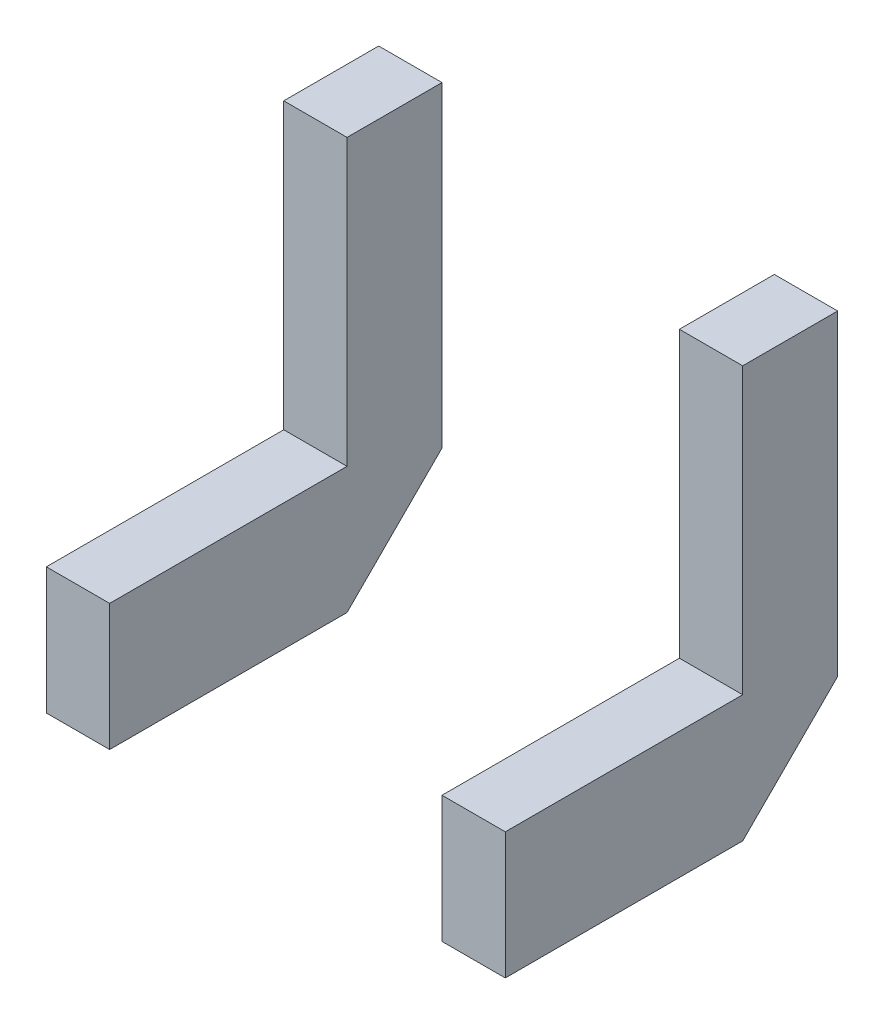
ISO-10303-21;
HEADER;
FILE_DESCRIPTION(('STEP AP214'),'2;1');
FILE_NAME('part.step','',(''),(''),'','','');
FILE_SCHEMA(('AUTOMOTIVE_DESIGN { 1 0 10303 214 1 1 1 1 }'));
ENDSEC;
DATA;
#1=APPLICATION_CONTEXT('core data for automotive mechanical design processes');
#2=APPLICATION_PROTOCOL_DEFINITION('international standard','automotive_design',2000,#1);
#3=PRODUCT_CONTEXT('',#1,'mechanical');
#4=PRODUCT('Part','Part','',(#3));
#5=PRODUCT_RELATED_PRODUCT_CATEGORY('part','',(#4));
#6=PRODUCT_DEFINITION_FORMATION('','',#4);
#7=PRODUCT_DEFINITION_CONTEXT('part definition',#1,'design');
#8=PRODUCT_DEFINITION('design','',#6,#7);
#9=PRODUCT_DEFINITION_SHAPE('','',#8);
#10=(LENGTH_UNIT() NAMED_UNIT(*) SI_UNIT(.MILLI.,.METRE.));
#11=(NAMED_UNIT(*) PLANE_ANGLE_UNIT() SI_UNIT($,.RADIAN.));
#12=(NAMED_UNIT(*) SI_UNIT($,.STERADIAN.) SOLID_ANGLE_UNIT());
#13=UNCERTAINTY_MEASURE_WITH_UNIT(LENGTH_MEASURE(1.E-05),#10,'distance_accuracy_value','');
#14=(GEOMETRIC_REPRESENTATION_CONTEXT(3) GLOBAL_UNCERTAINTY_ASSIGNED_CONTEXT((#13)) GLOBAL_UNIT_ASSIGNED_CONTEXT((#10,
#11,#12)) REPRESENTATION_CONTEXT('',''));
#15=CARTESIAN_POINT('',(0.,0.,0.));
#16=DIRECTION('',(0.,0.,1.));
#17=DIRECTION('',(1.,0.,0.));
#18=AXIS2_PLACEMENT_3D('',#15,#16,#17);
#19=CARTESIAN_POINT('',(12.22499934,-13.67500066,1.05));
#20=DIRECTION('',(-1.,0.,0.));
#21=DIRECTION('',(0.,0.,1.));
#22=AXIS2_PLACEMENT_3D('',#19,#20,#21);
#23=PLANE('',#22);
#24=DIRECTION('',(0.,-0.707106781186548,0.707106781186548));
#25=VECTOR('',#24,1.);
#26=CARTESIAN_POINT('',(12.22499934,-14.67500066,0.));
#27=LINE('',#26,#25);
#28=CARTESIAN_POINT('',(12.22499934,-14.97500066,0.3));
#29=VERTEX_POINT('',#28);
#30=CARTESIAN_POINT('',(12.22499934,-14.67500066,0.));
#31=VERTEX_POINT('',#30);
#32=EDGE_CURVE('P0_E110',#29,#31,#27,.F.);
#33=ORIENTED_EDGE('',*,*,#32,.T.);
#34=DIRECTION('',(0.,-1.,0.));
#35=VECTOR('',#34,1.);
#36=CARTESIAN_POINT('',(12.22499934,-13.67500066,0.));
#37=LINE('',#36,#35);
#38=CARTESIAN_POINT('',(12.22499934,-13.67500066,0.));
#39=VERTEX_POINT('',#38);
#40=EDGE_CURVE('P0_E88',#31,#39,#37,.F.);
#41=ORIENTED_EDGE('',*,*,#40,.T.);
#42=DIRECTION('',(0.,0.,1.));
#43=VECTOR('',#42,1.);
#44=CARTESIAN_POINT('',(12.22499934,-13.67500066,0.));
#45=LINE('',#44,#43);
#46=CARTESIAN_POINT('',(12.22499934,-13.67500066,0.3));
#47=VERTEX_POINT('',#46);
#48=EDGE_CURVE('P0_E20',#47,#39,#45,.F.);
#49=ORIENTED_EDGE('',*,*,#48,.F.);
#50=DIRECTION('',(0.,1.,0.));
#51=VECTOR('',#50,1.);
#52=CARTESIAN_POINT('',(12.22499934,-14.57500066,0.3));
#53=LINE('',#52,#51);
#54=CARTESIAN_POINT('',(12.22499934,-14.57500066,0.3));
#55=VERTEX_POINT('',#54);
#56=EDGE_CURVE('P0_E78',#47,#55,#53,.F.);
#57=ORIENTED_EDGE('',*,*,#56,.T.);
#58=DIRECTION('',(0.,0.,1.));
#59=VECTOR('',#58,1.);
#60=CARTESIAN_POINT('',(12.22499934,-14.57500066,1.05));
#61=LINE('',#60,#59);
#62=CARTESIAN_POINT('',(12.22499934,-14.57500066,1.05));
#63=VERTEX_POINT('',#62);
#64=EDGE_CURVE('P0_E73',#63,#55,#61,.F.);
#65=ORIENTED_EDGE('',*,*,#64,.F.);
#66=DIRECTION('',(0.,-1.,0.));
#67=VECTOR('',#66,1.);
#68=CARTESIAN_POINT('',(12.22499934,-14.97500066,1.05));
#69=LINE('',#68,#67);
#70=CARTESIAN_POINT('',(12.22499934,-14.97500066,1.05));
#71=VERTEX_POINT('',#70);
#72=EDGE_CURVE('P0_E99',#71,#63,#69,.F.);
#73=ORIENTED_EDGE('',*,*,#72,.F.);
#74=DIRECTION('',(0.,0.,-1.));
#75=VECTOR('',#74,1.);
#76=CARTESIAN_POINT('',(12.22499934,-14.97500066,0.3));
#77=LINE('',#76,#75);
#78=EDGE_CURVE('P0_E103',#29,#71,#77,.F.);
#79=ORIENTED_EDGE('',*,*,#78,.F.);
#80=EDGE_LOOP('',(#33,#41,#49,#57,#65,#73,#79));
#81=FACE_BOUND('',#80,.T.);
#82=ADVANCED_FACE('P0_F17',(#81),#23,.F.);
#83=CARTESIAN_POINT('',(12.02499934,-13.67500066,0.));
#84=DIRECTION('',(0.,1.,0.));
#85=DIRECTION('',(0.,0.,1.));
#86=AXIS2_PLACEMENT_3D('',#83,#84,#85);
#87=PLANE('',#86);
#88=DIRECTION('',(1.,0.,0.));
#89=VECTOR('',#88,1.);
#90=CARTESIAN_POINT('',(12.22499934,-13.67500066,0.));
#91=LINE('',#90,#89);
#92=CARTESIAN_POINT('',(12.02499934,-13.67500066,0.));
#93=VERTEX_POINT('',#92);
#94=EDGE_CURVE('P0_E112',#39,#93,#91,.F.);
#95=ORIENTED_EDGE('',*,*,#94,.T.);
#96=DIRECTION('',(0.,0.,-1.));
#97=VECTOR('',#96,1.);
#98=CARTESIAN_POINT('',(12.02499934,-13.67500066,1.05));
#99=LINE('',#98,#97);
#100=CARTESIAN_POINT('',(12.02499934,-13.67500066,0.3));
#101=VERTEX_POINT('',#100);
#102=EDGE_CURVE('P0_E94',#93,#101,#99,.F.);
#103=ORIENTED_EDGE('',*,*,#102,.T.);
#104=DIRECTION('',(-1.,0.,0.));
#105=VECTOR('',#104,1.);
#106=CARTESIAN_POINT('',(12.22499934,-13.67500066,0.3));
#107=LINE('',#106,#105);
#108=EDGE_CURVE('P0_E83',#101,#47,#107,.F.);
#109=ORIENTED_EDGE('',*,*,#108,.T.);
#110=ORIENTED_EDGE('',*,*,#48,.T.);
#111=EDGE_LOOP('',(#95,#103,#109,#110));
#112=FACE_BOUND('',#111,.T.);
#113=ADVANCED_FACE('P0_F93',(#112),#87,.T.);
#114=CARTESIAN_POINT('',(12.22499934,-14.57500066,0.3));
#115=DIRECTION('',(0.,0.,-1.));
#116=DIRECTION('',(-1.,0.,0.));
#117=AXIS2_PLACEMENT_3D('',#114,#115,#116);
#118=PLANE('',#117);
#119=DIRECTION('',(0.,1.,0.));
#120=VECTOR('',#119,1.);
#121=CARTESIAN_POINT('',(12.02499934,-13.67500066,0.3));
#122=LINE('',#121,#120);
#123=CARTESIAN_POINT('',(12.02499934,-14.57500066,0.3));
#124=VERTEX_POINT('',#123);
#125=EDGE_CURVE('P0_E117',#101,#124,#122,.F.);
#126=ORIENTED_EDGE('',*,*,#125,.T.);
#127=DIRECTION('',(1.,0.,0.));
#128=VECTOR('',#127,1.);
#129=CARTESIAN_POINT('',(12.22499934,-14.57500066,0.3));
#130=LINE('',#129,#128);
#131=EDGE_CURVE('P0_E85',#55,#124,#130,.F.);
#132=ORIENTED_EDGE('',*,*,#131,.F.);
#133=ORIENTED_EDGE('',*,*,#56,.F.);
#134=ORIENTED_EDGE('',*,*,#108,.F.);
#135=EDGE_LOOP('',(#126,#132,#133,#134));
#136=FACE_BOUND('',#135,.T.);
#137=ADVANCED_FACE('P0_F81',(#136),#118,.F.);
#138=CARTESIAN_POINT('',(12.22499934,-14.57500066,1.05));
#139=DIRECTION('',(0.,1.,0.));
#140=DIRECTION('',(0.,0.,1.));
#141=AXIS2_PLACEMENT_3D('',#138,#139,#140);
#142=PLANE('',#141);
#143=DIRECTION('',(0.,0.,-1.));
#144=VECTOR('',#143,1.);
#145=CARTESIAN_POINT('',(12.02499934,-14.57500066,1.05));
#146=LINE('',#145,#144);
#147=CARTESIAN_POINT('',(12.02499934,-14.57500066,1.05));
#148=VERTEX_POINT('',#147);
#149=EDGE_CURVE('P0_E119',#124,#148,#146,.F.);
#150=ORIENTED_EDGE('',*,*,#149,.T.);
#151=DIRECTION('',(1.,0.,0.));
#152=VECTOR('',#151,1.);
#153=CARTESIAN_POINT('',(10.77499934,-14.57500066,1.05));
#154=LINE('',#153,#152);
#155=EDGE_CURVE('P0_E101',#63,#148,#154,.F.);
#156=ORIENTED_EDGE('',*,*,#155,.F.);
#157=ORIENTED_EDGE('',*,*,#64,.T.);
#158=ORIENTED_EDGE('',*,*,#131,.T.);
#159=EDGE_LOOP('',(#150,#156,#157,#158));
#160=FACE_BOUND('',#159,.T.);
#161=ADVANCED_FACE('P0_F144',(#160),#142,.T.);
#162=CARTESIAN_POINT('',(10.77499934,-14.97500066,1.05));
#163=DIRECTION('',(0.,0.,1.));
#164=DIRECTION('',(0.,-1.,0.));
#165=AXIS2_PLACEMENT_3D('',#162,#163,#164);
#166=PLANE('',#165);
#167=ORIENTED_EDGE('',*,*,#72,.T.);
#168=ORIENTED_EDGE('',*,*,#155,.T.);
#169=DIRECTION('',(0.,1.,0.));
#170=VECTOR('',#169,1.);
#171=CARTESIAN_POINT('',(12.02499934,-13.67500066,1.05));
#172=LINE('',#171,#170);
#173=CARTESIAN_POINT('',(12.02499934,-14.97500066,1.05));
#174=VERTEX_POINT('',#173);
#175=EDGE_CURVE('P0_E122',#148,#174,#172,.F.);
#176=ORIENTED_EDGE('',*,*,#175,.T.);
#177=DIRECTION('',(1.,0.,0.));
#178=VECTOR('',#177,1.);
#179=CARTESIAN_POINT('',(10.77499934,-14.97500066,1.05));
#180=LINE('',#179,#178);
#181=EDGE_CURVE('P0_E105',#71,#174,#180,.F.);
#182=ORIENTED_EDGE('',*,*,#181,.F.);
#183=EDGE_LOOP('',(#167,#168,#176,#182));
#184=FACE_BOUND('',#183,.T.);
#185=ADVANCED_FACE('P0_F142',(#184),#166,.T.);
#186=CARTESIAN_POINT('',(10.77499934,-14.97500066,0.3));
#187=DIRECTION('',(0.,-1.,0.));
#188=DIRECTION('',(0.,0.,-1.));
#189=AXIS2_PLACEMENT_3D('',#186,#187,#188);
#190=PLANE('',#189);
#191=ORIENTED_EDGE('',*,*,#78,.T.);
#192=ORIENTED_EDGE('',*,*,#181,.T.);
#193=DIRECTION('',(0.,0.,-1.));
#194=VECTOR('',#193,1.);
#195=CARTESIAN_POINT('',(12.02499934,-14.97500066,1.05));
#196=LINE('',#195,#194);
#197=CARTESIAN_POINT('',(12.02499934,-14.97500066,0.3));
#198=VERTEX_POINT('',#197);
#199=EDGE_CURVE('P0_E125',#174,#198,#196,.T.);
#200=ORIENTED_EDGE('',*,*,#199,.T.);
#201=DIRECTION('',(1.,0.,0.));
#202=VECTOR('',#201,1.);
#203=CARTESIAN_POINT('',(12.22499934,-14.97500066,0.3));
#204=LINE('',#203,#202);
#205=EDGE_CURVE('P0_E107',#198,#29,#204,.T.);
#206=ORIENTED_EDGE('',*,*,#205,.T.);
#207=EDGE_LOOP('',(#191,#192,#200,#206));
#208=FACE_BOUND('',#207,.T.);
#209=ADVANCED_FACE('P0_F138',(#208),#190,.T.);
#210=CARTESIAN_POINT('',(12.22499934,-14.67500066,0.));
#211=DIRECTION('',(0.,0.707106781186548,0.707106781186548));
#212=DIRECTION('',(0.,-0.707106781186548,0.707106781186548));
#213=AXIS2_PLACEMENT_3D('',#210,#211,#212);
#214=PLANE('',#213);
#215=ORIENTED_EDGE('',*,*,#205,.F.);
#216=DIRECTION('',(0.,0.707106781186545,-0.70710678118655));
#217=VECTOR('',#216,1.);
#218=CARTESIAN_POINT('',(12.02499934,-14.97500066,0.3));
#219=LINE('',#218,#217);
#220=CARTESIAN_POINT('',(12.02499934,-14.67500066,0.));
#221=VERTEX_POINT('',#220);
#222=EDGE_CURVE('P0_E26',#198,#221,#219,.T.);
#223=ORIENTED_EDGE('',*,*,#222,.T.);
#224=DIRECTION('',(1.,0.,0.));
#225=VECTOR('',#224,1.);
#226=CARTESIAN_POINT('',(12.22499934,-14.67500066,0.));
#227=LINE('',#226,#225);
#228=EDGE_CURVE('P0_E34',#221,#31,#227,.T.);
#229=ORIENTED_EDGE('',*,*,#228,.T.);
#230=ORIENTED_EDGE('',*,*,#32,.F.);
#231=EDGE_LOOP('',(#215,#223,#229,#230));
#232=FACE_BOUND('',#231,.T.);
#233=ADVANCED_FACE('P0_F131',(#232),#214,.F.);
#234=CARTESIAN_POINT('',(12.22499934,-13.67500066,0.));
#235=DIRECTION('',(0.,0.,1.));
#236=DIRECTION('',(0.,-1.,0.));
#237=AXIS2_PLACEMENT_3D('',#234,#235,#236);
#238=PLANE('',#237);
#239=ORIENTED_EDGE('',*,*,#228,.F.);
#240=DIRECTION('',(0.,1.,0.));
#241=VECTOR('',#240,1.);
#242=CARTESIAN_POINT('',(12.02499934,-13.67500066,0.));
#243=LINE('',#242,#241);
#244=EDGE_CURVE('P0_E11',#221,#93,#243,.T.);
#245=ORIENTED_EDGE('',*,*,#244,.T.);
#246=ORIENTED_EDGE('',*,*,#94,.F.);
#247=ORIENTED_EDGE('',*,*,#40,.F.);
#248=EDGE_LOOP('',(#239,#245,#246,#247));
#249=FACE_BOUND('',#248,.T.);
#250=ADVANCED_FACE('P0_F155',(#249),#238,.F.);
#251=CARTESIAN_POINT('',(12.02499934,-13.67500066,1.05));
#252=DIRECTION('',(1.,0.,0.));
#253=DIRECTION('',(0.,0.,-1.));
#254=AXIS2_PLACEMENT_3D('',#251,#252,#253);
#255=PLANE('',#254);
#256=ORIENTED_EDGE('',*,*,#222,.F.);
#257=ORIENTED_EDGE('',*,*,#199,.F.);
#258=ORIENTED_EDGE('',*,*,#175,.F.);
#259=ORIENTED_EDGE('',*,*,#149,.F.);
#260=ORIENTED_EDGE('',*,*,#125,.F.);
#261=ORIENTED_EDGE('',*,*,#102,.F.);
#262=ORIENTED_EDGE('',*,*,#244,.F.);
#263=EDGE_LOOP('',(#256,#257,#258,#259,#260,#261,#262));
#264=FACE_BOUND('',#263,.T.);
#265=ADVANCED_FACE('P0_F135',(#264),#255,.F.);
#266=CLOSED_SHELL('',(#82,#113,#137,#161,#185,#209,#233,#250,#265));
#267=MANIFOLD_SOLID_BREP('P0_B1',#266);
#268=CARTESIAN_POINT('',(10.97499934,-13.67500066,1.05));
#269=DIRECTION('',(-1.,0.,0.));
#270=DIRECTION('',(0.,0.,1.));
#271=AXIS2_PLACEMENT_3D('',#268,#269,#270);
#272=PLANE('',#271);
#273=DIRECTION('',(0.,-0.707106781186548,0.707106781186548));
#274=VECTOR('',#273,1.);
#275=CARTESIAN_POINT('',(10.97499934,-14.67500066,0.));
#276=LINE('',#275,#274);
#277=CARTESIAN_POINT('',(10.97499934,-14.97500066,0.3));
#278=VERTEX_POINT('',#277);
#279=CARTESIAN_POINT('',(10.97499934,-14.67500066,0.));
#280=VERTEX_POINT('',#279);
#281=EDGE_CURVE('P1_E110',#278,#280,#276,.F.);
#282=ORIENTED_EDGE('',*,*,#281,.T.);
#283=DIRECTION('',(0.,-1.,0.));
#284=VECTOR('',#283,1.);
#285=CARTESIAN_POINT('',(10.97499934,-13.67500066,0.));
#286=LINE('',#285,#284);
#287=CARTESIAN_POINT('',(10.97499934,-13.67500066,0.));
#288=VERTEX_POINT('',#287);
#289=EDGE_CURVE('P1_E88',#280,#288,#286,.F.);
#290=ORIENTED_EDGE('',*,*,#289,.T.);
#291=DIRECTION('',(0.,0.,1.));
#292=VECTOR('',#291,1.);
#293=CARTESIAN_POINT('',(10.97499934,-13.67500066,0.));
#294=LINE('',#293,#292);
#295=CARTESIAN_POINT('',(10.97499934,-13.67500066,0.3));
#296=VERTEX_POINT('',#295);
#297=EDGE_CURVE('P1_E20',#296,#288,#294,.F.);
#298=ORIENTED_EDGE('',*,*,#297,.F.);
#299=DIRECTION('',(0.,1.,0.));
#300=VECTOR('',#299,1.);
#301=CARTESIAN_POINT('',(10.97499934,-14.57500066,0.3));
#302=LINE('',#301,#300);
#303=CARTESIAN_POINT('',(10.97499934,-14.57500066,0.3));
#304=VERTEX_POINT('',#303);
#305=EDGE_CURVE('P1_E78',#296,#304,#302,.F.);
#306=ORIENTED_EDGE('',*,*,#305,.T.);
#307=DIRECTION('',(0.,0.,1.));
#308=VECTOR('',#307,1.);
#309=CARTESIAN_POINT('',(10.97499934,-14.57500066,1.05));
#310=LINE('',#309,#308);
#311=CARTESIAN_POINT('',(10.97499934,-14.57500066,1.05));
#312=VERTEX_POINT('',#311);
#313=EDGE_CURVE('P1_E73',#312,#304,#310,.F.);
#314=ORIENTED_EDGE('',*,*,#313,.F.);
#315=DIRECTION('',(0.,-1.,0.));
#316=VECTOR('',#315,1.);
#317=CARTESIAN_POINT('',(10.97499934,-14.97500066,1.05));
#318=LINE('',#317,#316);
#319=CARTESIAN_POINT('',(10.97499934,-14.97500066,1.05));
#320=VERTEX_POINT('',#319);
#321=EDGE_CURVE('P1_E99',#320,#312,#318,.F.);
#322=ORIENTED_EDGE('',*,*,#321,.F.);
#323=DIRECTION('',(0.,0.,-1.));
#324=VECTOR('',#323,1.);
#325=CARTESIAN_POINT('',(10.97499934,-14.97500066,0.3));
#326=LINE('',#325,#324);
#327=EDGE_CURVE('P1_E103',#278,#320,#326,.F.);
#328=ORIENTED_EDGE('',*,*,#327,.F.);
#329=EDGE_LOOP('',(#282,#290,#298,#306,#314,#322,#328));
#330=FACE_BOUND('',#329,.T.);
#331=ADVANCED_FACE('P1_F17',(#330),#272,.F.);
#332=CARTESIAN_POINT('',(10.77499934,-13.67500066,0.));
#333=DIRECTION('',(0.,1.,0.));
#334=DIRECTION('',(0.,0.,1.));
#335=AXIS2_PLACEMENT_3D('',#332,#333,#334);
#336=PLANE('',#335);
#337=DIRECTION('',(1.,0.,0.));
#338=VECTOR('',#337,1.);
#339=CARTESIAN_POINT('',(10.97499934,-13.67500066,0.));
#340=LINE('',#339,#338);
#341=CARTESIAN_POINT('',(10.77499934,-13.67500066,0.));
#342=VERTEX_POINT('',#341);
#343=EDGE_CURVE('P1_E112',#288,#342,#340,.F.);
#344=ORIENTED_EDGE('',*,*,#343,.T.);
#345=DIRECTION('',(0.,0.,-1.));
#346=VECTOR('',#345,1.);
#347=CARTESIAN_POINT('',(10.77499934,-13.67500066,1.05));
#348=LINE('',#347,#346);
#349=CARTESIAN_POINT('',(10.77499934,-13.67500066,0.3));
#350=VERTEX_POINT('',#349);
#351=EDGE_CURVE('P1_E94',#342,#350,#348,.F.);
#352=ORIENTED_EDGE('',*,*,#351,.T.);
#353=DIRECTION('',(-1.,0.,0.));
#354=VECTOR('',#353,1.);
#355=CARTESIAN_POINT('',(10.97499934,-13.67500066,0.3));
#356=LINE('',#355,#354);
#357=EDGE_CURVE('P1_E83',#350,#296,#356,.F.);
#358=ORIENTED_EDGE('',*,*,#357,.T.);
#359=ORIENTED_EDGE('',*,*,#297,.T.);
#360=EDGE_LOOP('',(#344,#352,#358,#359));
#361=FACE_BOUND('',#360,.T.);
#362=ADVANCED_FACE('P1_F93',(#361),#336,.T.);
#363=CARTESIAN_POINT('',(10.97499934,-14.57500066,0.3));
#364=DIRECTION('',(0.,0.,-1.));
#365=DIRECTION('',(-1.,0.,0.));
#366=AXIS2_PLACEMENT_3D('',#363,#364,#365);
#367=PLANE('',#366);
#368=DIRECTION('',(0.,1.,0.));
#369=VECTOR('',#368,1.);
#370=CARTESIAN_POINT('',(10.77499934,-13.67500066,0.3));
#371=LINE('',#370,#369);
#372=CARTESIAN_POINT('',(10.77499934,-14.57500066,0.3));
#373=VERTEX_POINT('',#372);
#374=EDGE_CURVE('P1_E117',#350,#373,#371,.F.);
#375=ORIENTED_EDGE('',*,*,#374,.T.);
#376=DIRECTION('',(1.,0.,0.));
#377=VECTOR('',#376,1.);
#378=CARTESIAN_POINT('',(10.97499934,-14.57500066,0.3));
#379=LINE('',#378,#377);
#380=EDGE_CURVE('P1_E85',#304,#373,#379,.F.);
#381=ORIENTED_EDGE('',*,*,#380,.F.);
#382=ORIENTED_EDGE('',*,*,#305,.F.);
#383=ORIENTED_EDGE('',*,*,#357,.F.);
#384=EDGE_LOOP('',(#375,#381,#382,#383));
#385=FACE_BOUND('',#384,.T.);
#386=ADVANCED_FACE('P1_F81',(#385),#367,.F.);
#387=CARTESIAN_POINT('',(10.97499934,-14.57500066,1.05));
#388=DIRECTION('',(0.,1.,0.));
#389=DIRECTION('',(0.,0.,1.));
#390=AXIS2_PLACEMENT_3D('',#387,#388,#389);
#391=PLANE('',#390);
#392=DIRECTION('',(0.,0.,-1.));
#393=VECTOR('',#392,1.);
#394=CARTESIAN_POINT('',(10.77499934,-14.57500066,1.05));
#395=LINE('',#394,#393);
#396=CARTESIAN_POINT('',(10.77499934,-14.57500066,1.05));
#397=VERTEX_POINT('',#396);
#398=EDGE_CURVE('P1_E119',#373,#397,#395,.F.);
#399=ORIENTED_EDGE('',*,*,#398,.T.);
#400=DIRECTION('',(1.,0.,0.));
#401=VECTOR('',#400,1.);
#402=CARTESIAN_POINT('',(10.77499934,-14.57500066,1.05));
#403=LINE('',#402,#401);
#404=EDGE_CURVE('P1_E101',#312,#397,#403,.F.);
#405=ORIENTED_EDGE('',*,*,#404,.F.);
#406=ORIENTED_EDGE('',*,*,#313,.T.);
#407=ORIENTED_EDGE('',*,*,#380,.T.);
#408=EDGE_LOOP('',(#399,#405,#406,#407));
#409=FACE_BOUND('',#408,.T.);
#410=ADVANCED_FACE('P1_F144',(#409),#391,.T.);
#411=CARTESIAN_POINT('',(10.77499934,-14.97500066,1.05));
#412=DIRECTION('',(0.,0.,1.));
#413=DIRECTION('',(0.,-1.,0.));
#414=AXIS2_PLACEMENT_3D('',#411,#412,#413);
#415=PLANE('',#414);
#416=ORIENTED_EDGE('',*,*,#321,.T.);
#417=ORIENTED_EDGE('',*,*,#404,.T.);
#418=DIRECTION('',(0.,1.,0.));
#419=VECTOR('',#418,1.);
#420=CARTESIAN_POINT('',(10.77499934,-13.67500066,1.05));
#421=LINE('',#420,#419);
#422=CARTESIAN_POINT('',(10.77499934,-14.97500066,1.05));
#423=VERTEX_POINT('',#422);
#424=EDGE_CURVE('P1_E122',#397,#423,#421,.F.);
#425=ORIENTED_EDGE('',*,*,#424,.T.);
#426=DIRECTION('',(1.,0.,0.));
#427=VECTOR('',#426,1.);
#428=CARTESIAN_POINT('',(10.77499934,-14.97500066,1.05));
#429=LINE('',#428,#427);
#430=EDGE_CURVE('P1_E105',#320,#423,#429,.F.);
#431=ORIENTED_EDGE('',*,*,#430,.F.);
#432=EDGE_LOOP('',(#416,#417,#425,#431));
#433=FACE_BOUND('',#432,.T.);
#434=ADVANCED_FACE('P1_F142',(#433),#415,.T.);
#435=CARTESIAN_POINT('',(10.77499934,-14.97500066,0.3));
#436=DIRECTION('',(0.,-1.,0.));
#437=DIRECTION('',(0.,0.,-1.));
#438=AXIS2_PLACEMENT_3D('',#435,#436,#437);
#439=PLANE('',#438);
#440=ORIENTED_EDGE('',*,*,#327,.T.);
#441=ORIENTED_EDGE('',*,*,#430,.T.);
#442=DIRECTION('',(0.,0.,-1.));
#443=VECTOR('',#442,1.);
#444=CARTESIAN_POINT('',(10.77499934,-14.97500066,1.05));
#445=LINE('',#444,#443);
#446=CARTESIAN_POINT('',(10.77499934,-14.97500066,0.3));
#447=VERTEX_POINT('',#446);
#448=EDGE_CURVE('P1_E125',#423,#447,#445,.T.);
#449=ORIENTED_EDGE('',*,*,#448,.T.);
#450=DIRECTION('',(1.,0.,0.));
#451=VECTOR('',#450,1.);
#452=CARTESIAN_POINT('',(10.97499934,-14.97500066,0.3));
#453=LINE('',#452,#451);
#454=EDGE_CURVE('P1_E107',#447,#278,#453,.T.);
#455=ORIENTED_EDGE('',*,*,#454,.T.);
#456=EDGE_LOOP('',(#440,#441,#449,#455));
#457=FACE_BOUND('',#456,.T.);
#458=ADVANCED_FACE('P1_F138',(#457),#439,.T.);
#459=CARTESIAN_POINT('',(10.97499934,-14.67500066,0.));
#460=DIRECTION('',(0.,0.707106781186548,0.707106781186548));
#461=DIRECTION('',(0.,-0.707106781186548,0.707106781186548));
#462=AXIS2_PLACEMENT_3D('',#459,#460,#461);
#463=PLANE('',#462);
#464=ORIENTED_EDGE('',*,*,#454,.F.);
#465=DIRECTION('',(0.,0.707106781186545,-0.70710678118655));
#466=VECTOR('',#465,1.);
#467=CARTESIAN_POINT('',(10.77499934,-14.97500066,0.3));
#468=LINE('',#467,#466);
#469=CARTESIAN_POINT('',(10.77499934,-14.67500066,0.));
#470=VERTEX_POINT('',#469);
#471=EDGE_CURVE('P1_E26',#447,#470,#468,.T.);
#472=ORIENTED_EDGE('',*,*,#471,.T.);
#473=DIRECTION('',(1.,0.,0.));
#474=VECTOR('',#473,1.);
#475=CARTESIAN_POINT('',(10.97499934,-14.67500066,0.));
#476=LINE('',#475,#474);
#477=EDGE_CURVE('P1_E34',#470,#280,#476,.T.);
#478=ORIENTED_EDGE('',*,*,#477,.T.);
#479=ORIENTED_EDGE('',*,*,#281,.F.);
#480=EDGE_LOOP('',(#464,#472,#478,#479));
#481=FACE_BOUND('',#480,.T.);
#482=ADVANCED_FACE('P1_F131',(#481),#463,.F.);
#483=CARTESIAN_POINT('',(10.97499934,-13.67500066,0.));
#484=DIRECTION('',(0.,0.,1.));
#485=DIRECTION('',(0.,-1.,0.));
#486=AXIS2_PLACEMENT_3D('',#483,#484,#485);
#487=PLANE('',#486);
#488=ORIENTED_EDGE('',*,*,#477,.F.);
#489=DIRECTION('',(0.,1.,0.));
#490=VECTOR('',#489,1.);
#491=CARTESIAN_POINT('',(10.77499934,-13.67500066,0.));
#492=LINE('',#491,#490);
#493=EDGE_CURVE('P1_E11',#470,#342,#492,.T.);
#494=ORIENTED_EDGE('',*,*,#493,.T.);
#495=ORIENTED_EDGE('',*,*,#343,.F.);
#496=ORIENTED_EDGE('',*,*,#289,.F.);
#497=EDGE_LOOP('',(#488,#494,#495,#496));
#498=FACE_BOUND('',#497,.T.);
#499=ADVANCED_FACE('P1_F155',(#498),#487,.F.);
#500=CARTESIAN_POINT('',(10.77499934,-13.67500066,1.05));
#501=DIRECTION('',(1.,0.,0.));
#502=DIRECTION('',(0.,0.,-1.));
#503=AXIS2_PLACEMENT_3D('',#500,#501,#502);
#504=PLANE('',#503);
#505=ORIENTED_EDGE('',*,*,#471,.F.);
#506=ORIENTED_EDGE('',*,*,#448,.F.);
#507=ORIENTED_EDGE('',*,*,#424,.F.);
#508=ORIENTED_EDGE('',*,*,#398,.F.);
#509=ORIENTED_EDGE('',*,*,#374,.F.);
#510=ORIENTED_EDGE('',*,*,#351,.F.);
#511=ORIENTED_EDGE('',*,*,#493,.F.);
#512=EDGE_LOOP('',(#505,#506,#507,#508,#509,#510,#511));
#513=FACE_BOUND('',#512,.T.);
#514=ADVANCED_FACE('P1_F135',(#513),#504,.F.);
#515=CLOSED_SHELL('',(#331,#362,#386,#410,#434,#458,#482,#499,#514));
#516=MANIFOLD_SOLID_BREP('P1_B1',#515);
#517=ADVANCED_BREP_SHAPE_REPRESENTATION('',(#18,#267,#516),#14);
#518=SHAPE_DEFINITION_REPRESENTATION(#9,#517);
ENDSEC;
END-ISO-10303-21;
